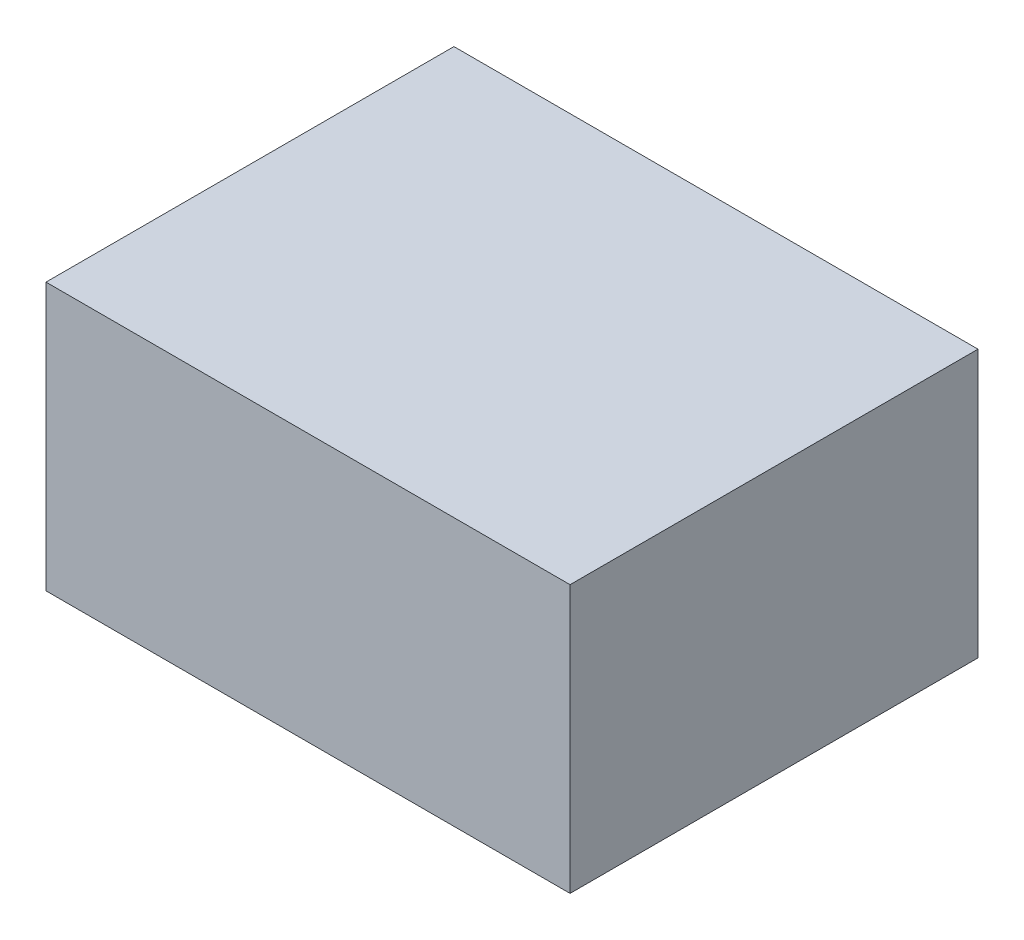
ISO-10303-21;
HEADER;
FILE_DESCRIPTION(('STEP AP214'),'2;1');
FILE_NAME('part.step','',(''),(''),'','','');
FILE_SCHEMA(('AUTOMOTIVE_DESIGN { 1 0 10303 214 1 1 1 1 }'));
ENDSEC;
DATA;
#1=APPLICATION_CONTEXT('core data for automotive mechanical design processes');
#2=APPLICATION_PROTOCOL_DEFINITION('international standard','automotive_design',2000,#1);
#3=PRODUCT_CONTEXT('',#1,'mechanical');
#4=PRODUCT('Part','Part','',(#3));
#5=PRODUCT_RELATED_PRODUCT_CATEGORY('part','',(#4));
#6=PRODUCT_DEFINITION_FORMATION('','',#4);
#7=PRODUCT_DEFINITION_CONTEXT('part definition',#1,'design');
#8=PRODUCT_DEFINITION('design','',#6,#7);
#9=PRODUCT_DEFINITION_SHAPE('','',#8);
#10=(LENGTH_UNIT() NAMED_UNIT(*) SI_UNIT(.MILLI.,.METRE.));
#11=(NAMED_UNIT(*) PLANE_ANGLE_UNIT() SI_UNIT($,.RADIAN.));
#12=(NAMED_UNIT(*) SI_UNIT($,.STERADIAN.) SOLID_ANGLE_UNIT());
#13=UNCERTAINTY_MEASURE_WITH_UNIT(LENGTH_MEASURE(1.E-05),#10,'distance_accuracy_value','');
#14=(GEOMETRIC_REPRESENTATION_CONTEXT(3) GLOBAL_UNCERTAINTY_ASSIGNED_CONTEXT((#13)) GLOBAL_UNIT_ASSIGNED_CONTEXT((#10,
#11,#12)) REPRESENTATION_CONTEXT('',''));
#15=CARTESIAN_POINT('',(0.,0.,0.));
#16=DIRECTION('',(0.,0.,1.));
#17=DIRECTION('',(1.,0.,0.));
#18=AXIS2_PLACEMENT_3D('',#15,#16,#17);
#19=CARTESIAN_POINT('',(34.3,17.5,-26.7));
#20=DIRECTION('',(-1.,0.,0.));
#21=DIRECTION('',(0.,0.,1.));
#22=AXIS2_PLACEMENT_3D('',#19,#20,#21);
#23=PLANE('',#22);
#24=DIRECTION('',(0.,0.,-1.));
#25=VECTOR('',#24,1.);
#26=CARTESIAN_POINT('',(34.3,-17.5,-26.7));
#27=LINE('',#26,#25);
#28=CARTESIAN_POINT('',(34.3,-17.5,26.7));
#29=VERTEX_POINT('',#28);
#30=CARTESIAN_POINT('',(34.3,-17.5,-26.7));
#31=VERTEX_POINT('',#30);
#32=EDGE_CURVE('E95',#29,#31,#27,.T.);
#33=ORIENTED_EDGE('',*,*,#32,.T.);
#34=DIRECTION('',(0.,-1.,0.));
#35=VECTOR('',#34,1.);
#36=CARTESIAN_POINT('',(34.3,17.5,-26.7));
#37=LINE('',#36,#35);
#38=CARTESIAN_POINT('',(34.3,17.5,-26.7));
#39=VERTEX_POINT('',#38);
#40=EDGE_CURVE('E11',#39,#31,#37,.T.);
#41=ORIENTED_EDGE('',*,*,#40,.F.);
#42=DIRECTION('',(0.,0.,-1.));
#43=VECTOR('',#42,1.);
#44=CARTESIAN_POINT('',(34.3,17.5,-26.7));
#45=LINE('',#44,#43);
#46=CARTESIAN_POINT('',(34.3,17.5,26.7));
#47=VERTEX_POINT('',#46);
#48=EDGE_CURVE('E83',#47,#39,#45,.T.);
#49=ORIENTED_EDGE('',*,*,#48,.F.);
#50=DIRECTION('',(0.,-1.,0.));
#51=VECTOR('',#50,1.);
#52=CARTESIAN_POINT('',(34.3,17.5,26.7));
#53=LINE('',#52,#51);
#54=EDGE_CURVE('E91',#47,#29,#53,.T.);
#55=ORIENTED_EDGE('',*,*,#54,.T.);
#56=EDGE_LOOP('',(#33,#41,#49,#55));
#57=FACE_BOUND('',#56,.T.);
#58=ADVANCED_FACE('F32',(#57),#23,.F.);
#59=CARTESIAN_POINT('',(-34.3,17.5,-26.7));
#60=DIRECTION('',(0.,0.,1.));
#61=DIRECTION('',(1.,0.,0.));
#62=AXIS2_PLACEMENT_3D('',#59,#60,#61);
#63=PLANE('',#62);
#64=DIRECTION('',(-1.,0.,0.));
#65=VECTOR('',#64,1.);
#66=CARTESIAN_POINT('',(-34.3,-17.5,-26.7));
#67=LINE('',#66,#65);
#68=CARTESIAN_POINT('',(-34.3,-17.5,-26.7));
#69=VERTEX_POINT('',#68);
#70=EDGE_CURVE('E87',#31,#69,#67,.T.);
#71=ORIENTED_EDGE('',*,*,#70,.T.);
#72=DIRECTION('',(0.,-1.,0.));
#73=VECTOR('',#72,1.);
#74=CARTESIAN_POINT('',(-34.3,17.5,-26.7));
#75=LINE('',#74,#73);
#76=CARTESIAN_POINT('',(-34.3,17.5,-26.7));
#77=VERTEX_POINT('',#76);
#78=EDGE_CURVE('E40',#77,#69,#75,.T.);
#79=ORIENTED_EDGE('',*,*,#78,.F.);
#80=DIRECTION('',(-1.,0.,0.));
#81=VECTOR('',#80,1.);
#82=CARTESIAN_POINT('',(-34.3,17.5,-26.7));
#83=LINE('',#82,#81);
#84=EDGE_CURVE('E78',#39,#77,#83,.T.);
#85=ORIENTED_EDGE('',*,*,#84,.F.);
#86=ORIENTED_EDGE('',*,*,#40,.T.);
#87=EDGE_LOOP('',(#71,#79,#85,#86));
#88=FACE_BOUND('',#87,.T.);
#89=ADVANCED_FACE('F86',(#88),#63,.F.);
#90=CARTESIAN_POINT('',(-34.3,17.5,-26.7));
#91=DIRECTION('',(1.,0.,0.));
#92=DIRECTION('',(0.,0.,-1.));
#93=AXIS2_PLACEMENT_3D('',#90,#91,#92);
#94=PLANE('',#93);
#95=DIRECTION('',(0.,0.,1.));
#96=VECTOR('',#95,1.);
#97=CARTESIAN_POINT('',(-34.3,-17.5,-26.7));
#98=LINE('',#97,#96);
#99=CARTESIAN_POINT('',(-34.3,-17.5,26.7));
#100=VERTEX_POINT('',#99);
#101=EDGE_CURVE('E65',#69,#100,#98,.T.);
#102=ORIENTED_EDGE('',*,*,#101,.T.);
#103=DIRECTION('',(0.,-1.,0.));
#104=VECTOR('',#103,1.);
#105=CARTESIAN_POINT('',(-34.3,17.5,26.7));
#106=LINE('',#105,#104);
#107=CARTESIAN_POINT('',(-34.3,17.5,26.7));
#108=VERTEX_POINT('',#107);
#109=EDGE_CURVE('E88',#108,#100,#106,.T.);
#110=ORIENTED_EDGE('',*,*,#109,.F.);
#111=DIRECTION('',(0.,0.,1.));
#112=VECTOR('',#111,1.);
#113=CARTESIAN_POINT('',(-34.3,17.5,-26.7));
#114=LINE('',#113,#112);
#115=EDGE_CURVE('E81',#77,#108,#114,.T.);
#116=ORIENTED_EDGE('',*,*,#115,.F.);
#117=ORIENTED_EDGE('',*,*,#78,.T.);
#118=EDGE_LOOP('',(#102,#110,#116,#117));
#119=FACE_BOUND('',#118,.T.);
#120=ADVANCED_FACE('F89',(#119),#94,.F.);
#121=CARTESIAN_POINT('',(-34.3,17.5,26.7));
#122=DIRECTION('',(0.,0.,-1.));
#123=DIRECTION('',(-1.,0.,0.));
#124=AXIS2_PLACEMENT_3D('',#121,#122,#123);
#125=PLANE('',#124);
#126=DIRECTION('',(1.,0.,0.));
#127=VECTOR('',#126,1.);
#128=CARTESIAN_POINT('',(-34.3,-17.5,26.7));
#129=LINE('',#128,#127);
#130=EDGE_CURVE('E71',#100,#29,#129,.T.);
#131=ORIENTED_EDGE('',*,*,#130,.T.);
#132=ORIENTED_EDGE('',*,*,#54,.F.);
#133=DIRECTION('',(1.,0.,0.));
#134=VECTOR('',#133,1.);
#135=CARTESIAN_POINT('',(-34.3,17.5,26.7));
#136=LINE('',#135,#134);
#137=EDGE_CURVE('E48',#108,#47,#136,.T.);
#138=ORIENTED_EDGE('',*,*,#137,.F.);
#139=ORIENTED_EDGE('',*,*,#109,.T.);
#140=EDGE_LOOP('',(#131,#132,#138,#139));
#141=FACE_BOUND('',#140,.T.);
#142=ADVANCED_FACE('F102',(#141),#125,.F.);
#143=CARTESIAN_POINT('',(0.,17.5,0.));
#144=DIRECTION('',(0.,1.,0.));
#145=DIRECTION('',(0.,0.,1.));
#146=AXIS2_PLACEMENT_3D('',#143,#144,#145);
#147=PLANE('',#146);
#148=ORIENTED_EDGE('',*,*,#48,.T.);
#149=ORIENTED_EDGE('',*,*,#84,.T.);
#150=ORIENTED_EDGE('',*,*,#115,.T.);
#151=ORIENTED_EDGE('',*,*,#137,.T.);
#152=EDGE_LOOP('',(#148,#149,#150,#151));
#153=FACE_BOUND('',#152,.T.);
#154=ADVANCED_FACE('F79',(#153),#147,.T.);
#155=CARTESIAN_POINT('',(0.,-17.5,0.));
#156=DIRECTION('',(0.,1.,0.));
#157=DIRECTION('',(0.,0.,1.));
#158=AXIS2_PLACEMENT_3D('',#155,#156,#157);
#159=PLANE('',#158);
#160=ORIENTED_EDGE('',*,*,#32,.F.);
#161=ORIENTED_EDGE('',*,*,#130,.F.);
#162=ORIENTED_EDGE('',*,*,#101,.F.);
#163=ORIENTED_EDGE('',*,*,#70,.F.);
#164=EDGE_LOOP('',(#160,#161,#162,#163));
#165=FACE_BOUND('',#164,.T.);
#166=ADVANCED_FACE('F105',(#165),#159,.F.);
#167=CLOSED_SHELL('',(#58,#89,#120,#142,#154,#166));
#168=MANIFOLD_SOLID_BREP('B2',#167);
#169=ADVANCED_BREP_SHAPE_REPRESENTATION('',(#18,#168),#14);
#170=SHAPE_DEFINITION_REPRESENTATION(#9,#169);
ENDSEC;
END-ISO-10303-21;
